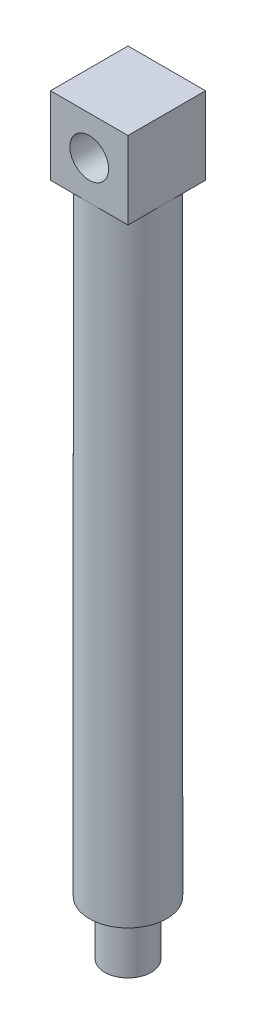
ISO-10303-21;
HEADER;
FILE_DESCRIPTION(('STEP AP214'),'2;1');
FILE_NAME('part.step','',(''),(''),'','','');
FILE_SCHEMA(('AUTOMOTIVE_DESIGN { 1 0 10303 214 1 1 1 1 }'));
ENDSEC;
DATA;
#1=APPLICATION_CONTEXT('core data for automotive mechanical design processes');
#2=APPLICATION_PROTOCOL_DEFINITION('international standard','automotive_design',2000,#1);
#3=PRODUCT_CONTEXT('',#1,'mechanical');
#4=PRODUCT('Part','Part','',(#3));
#5=PRODUCT_RELATED_PRODUCT_CATEGORY('part','',(#4));
#6=PRODUCT_DEFINITION_FORMATION('','',#4);
#7=PRODUCT_DEFINITION_CONTEXT('part definition',#1,'design');
#8=PRODUCT_DEFINITION('design','',#6,#7);
#9=PRODUCT_DEFINITION_SHAPE('','',#8);
#10=(LENGTH_UNIT() NAMED_UNIT(*) SI_UNIT(.MILLI.,.METRE.));
#11=(NAMED_UNIT(*) PLANE_ANGLE_UNIT() SI_UNIT($,.RADIAN.));
#12=(NAMED_UNIT(*) SI_UNIT($,.STERADIAN.) SOLID_ANGLE_UNIT());
#13=UNCERTAINTY_MEASURE_WITH_UNIT(LENGTH_MEASURE(1.E-05),#10,'distance_accuracy_value','');
#14=(GEOMETRIC_REPRESENTATION_CONTEXT(3) GLOBAL_UNCERTAINTY_ASSIGNED_CONTEXT((#13)) GLOBAL_UNIT_ASSIGNED_CONTEXT((#10,
#11,#12)) REPRESENTATION_CONTEXT('',''));
#15=CARTESIAN_POINT('',(0.,0.,0.));
#16=DIRECTION('',(0.,0.,1.));
#17=DIRECTION('',(1.,0.,0.));
#18=AXIS2_PLACEMENT_3D('',#15,#16,#17);
#19=CARTESIAN_POINT('',(0.,0.,10.));
#20=DIRECTION('',(0.,1.,0.));
#21=DIRECTION('',(0.,0.,1.));
#22=AXIS2_PLACEMENT_3D('',#19,#20,#21);
#23=PLANE('',#22);
#24=CARTESIAN_POINT('',(5.,0.,5.));
#25=DIRECTION('',(0.,-1.,0.));
#26=DIRECTION('',(0.,0.,-1.));
#27=AXIS2_PLACEMENT_3D('',#24,#25,#26);
#28=CIRCLE('',#27,5.);
#29=CARTESIAN_POINT('',(5.,0.,0.));
#30=VERTEX_POINT('',#29);
#31=CARTESIAN_POINT('',(10.,0.,5.));
#32=VERTEX_POINT('',#31);
#33=EDGE_CURVE('E117',#30,#32,#28,.T.);
#34=ORIENTED_EDGE('',*,*,#33,.F.);
#35=DIRECTION('',(1.,0.,0.));
#36=VECTOR('',#35,1.);
#37=CARTESIAN_POINT('',(0.,0.,0.));
#38=LINE('',#37,#36);
#39=CARTESIAN_POINT('',(10.,0.,0.));
#40=VERTEX_POINT('',#39);
#41=EDGE_CURVE('E104',#30,#40,#38,.T.);
#42=ORIENTED_EDGE('',*,*,#41,.T.);
#43=DIRECTION('',(0.,0.,-1.));
#44=VECTOR('',#43,1.);
#45=CARTESIAN_POINT('',(10.,0.,10.));
#46=LINE('',#45,#44);
#47=EDGE_CURVE('E118',#32,#40,#46,.T.);
#48=ORIENTED_EDGE('',*,*,#47,.F.);
#49=EDGE_LOOP('',(#34,#42,#48));
#50=FACE_BOUND('',#49,.T.);
#51=ADVANCED_FACE('F39',(#50),#23,.F.);
#52=CARTESIAN_POINT('',(5.,0.,10.));
#53=VERTEX_POINT('',#52);
#54=EDGE_CURVE('E49',#32,#53,#28,.T.);
#55=ORIENTED_EDGE('',*,*,#54,.F.);
#56=CARTESIAN_POINT('',(10.,0.,10.));
#57=VERTEX_POINT('',#56);
#58=EDGE_CURVE('E168',#57,#32,#46,.T.);
#59=ORIENTED_EDGE('',*,*,#58,.F.);
#60=DIRECTION('',(1.,0.,0.));
#61=VECTOR('',#60,1.);
#62=CARTESIAN_POINT('',(0.,0.,10.));
#63=LINE('',#62,#61);
#64=EDGE_CURVE('E152',#53,#57,#63,.T.);
#65=ORIENTED_EDGE('',*,*,#64,.F.);
#66=EDGE_LOOP('',(#55,#59,#65));
#67=FACE_BOUND('',#66,.T.);
#68=ADVANCED_FACE('F187',(#67),#23,.F.);
#69=CARTESIAN_POINT('',(0.,0.,5.));
#70=VERTEX_POINT('',#69);
#71=EDGE_CURVE('E65',#53,#70,#28,.T.);
#72=ORIENTED_EDGE('',*,*,#71,.F.);
#73=CARTESIAN_POINT('',(0.,0.,10.));
#74=VERTEX_POINT('',#73);
#75=EDGE_CURVE('E153',#74,#53,#63,.T.);
#76=ORIENTED_EDGE('',*,*,#75,.F.);
#77=DIRECTION('',(0.,0.,-1.));
#78=VECTOR('',#77,1.);
#79=CARTESIAN_POINT('',(0.,0.,10.));
#80=LINE('',#79,#78);
#81=EDGE_CURVE('E131',#74,#70,#80,.T.);
#82=ORIENTED_EDGE('',*,*,#81,.T.);
#83=EDGE_LOOP('',(#72,#76,#82));
#84=FACE_BOUND('',#83,.T.);
#85=ADVANCED_FACE('F190',(#84),#23,.F.);
#86=CARTESIAN_POINT('',(0.,10.,10.));
#87=DIRECTION('',(0.,1.,0.));
#88=DIRECTION('',(0.,0.,1.));
#89=AXIS2_PLACEMENT_3D('',#86,#87,#88);
#90=PLANE('',#89);
#91=DIRECTION('',(1.,0.,0.));
#92=VECTOR('',#91,1.);
#93=CARTESIAN_POINT('',(0.,10.,0.));
#94=LINE('',#93,#92);
#95=CARTESIAN_POINT('',(0.,10.,0.));
#96=VERTEX_POINT('',#95);
#97=CARTESIAN_POINT('',(10.,10.,0.));
#98=VERTEX_POINT('',#97);
#99=EDGE_CURVE('E139',#96,#98,#94,.T.);
#100=ORIENTED_EDGE('',*,*,#99,.F.);
#101=DIRECTION('',(0.,0.,-1.));
#102=VECTOR('',#101,1.);
#103=CARTESIAN_POINT('',(0.,10.,10.));
#104=LINE('',#103,#102);
#105=CARTESIAN_POINT('',(0.,10.,10.));
#106=VERTEX_POINT('',#105);
#107=EDGE_CURVE('E128',#106,#96,#104,.T.);
#108=ORIENTED_EDGE('',*,*,#107,.F.);
#109=DIRECTION('',(1.,0.,0.));
#110=VECTOR('',#109,1.);
#111=CARTESIAN_POINT('',(0.,10.,10.));
#112=LINE('',#111,#110);
#113=CARTESIAN_POINT('',(10.,10.,10.));
#114=VERTEX_POINT('',#113);
#115=EDGE_CURVE('E144',#106,#114,#112,.T.);
#116=ORIENTED_EDGE('',*,*,#115,.T.);
#117=DIRECTION('',(0.,0.,-1.));
#118=VECTOR('',#117,1.);
#119=CARTESIAN_POINT('',(10.,10.,10.));
#120=LINE('',#119,#118);
#121=EDGE_CURVE('E43',#114,#98,#120,.T.);
#122=ORIENTED_EDGE('',*,*,#121,.T.);
#123=EDGE_LOOP('',(#100,#108,#116,#122));
#124=FACE_BOUND('',#123,.T.);
#125=ADVANCED_FACE('F41',(#124),#90,.T.);
#126=CARTESIAN_POINT('',(0.,0.,10.));
#127=DIRECTION('',(-1.,0.,0.));
#128=DIRECTION('',(0.,0.,1.));
#129=AXIS2_PLACEMENT_3D('',#126,#127,#128);
#130=PLANE('',#129);
#131=DIRECTION('',(0.,1.,0.));
#132=VECTOR('',#131,1.);
#133=CARTESIAN_POINT('',(0.,0.,0.));
#134=LINE('',#133,#132);
#135=CARTESIAN_POINT('',(0.,0.,0.));
#136=VERTEX_POINT('',#135);
#137=EDGE_CURVE('E103',#136,#96,#134,.T.);
#138=ORIENTED_EDGE('',*,*,#137,.F.);
#139=EDGE_CURVE('E98',#70,#136,#80,.T.);
#140=ORIENTED_EDGE('',*,*,#139,.F.);
#141=ORIENTED_EDGE('',*,*,#81,.F.);
#142=DIRECTION('',(0.,1.,0.));
#143=VECTOR('',#142,1.);
#144=CARTESIAN_POINT('',(0.,0.,10.));
#145=LINE('',#144,#143);
#146=EDGE_CURVE('E157',#74,#106,#145,.T.);
#147=ORIENTED_EDGE('',*,*,#146,.T.);
#148=ORIENTED_EDGE('',*,*,#107,.T.);
#149=EDGE_LOOP('',(#138,#140,#141,#147,#148));
#150=FACE_BOUND('',#149,.T.);
#151=ADVANCED_FACE('F181',(#150),#130,.T.);
#152=EDGE_CURVE('E57',#70,#30,#28,.T.);
#153=ORIENTED_EDGE('',*,*,#152,.F.);
#154=ORIENTED_EDGE('',*,*,#139,.T.);
#155=EDGE_CURVE('E95',#136,#30,#38,.T.);
#156=ORIENTED_EDGE('',*,*,#155,.T.);
#157=EDGE_LOOP('',(#153,#154,#156));
#158=FACE_BOUND('',#157,.T.);
#159=ADVANCED_FACE('F97',(#158),#23,.F.);
#160=CARTESIAN_POINT('',(10.,10.,10.));
#161=DIRECTION('',(1.,0.,0.));
#162=DIRECTION('',(0.,1.,0.));
#163=AXIS2_PLACEMENT_3D('',#160,#161,#162);
#164=PLANE('',#163);
#165=DIRECTION('',(0.,-1.,0.));
#166=VECTOR('',#165,1.);
#167=CARTESIAN_POINT('',(10.,10.,0.));
#168=LINE('',#167,#166);
#169=EDGE_CURVE('E112',#98,#40,#168,.T.);
#170=ORIENTED_EDGE('',*,*,#169,.F.);
#171=ORIENTED_EDGE('',*,*,#121,.F.);
#172=DIRECTION('',(0.,-1.,0.));
#173=VECTOR('',#172,1.);
#174=CARTESIAN_POINT('',(10.,10.,10.));
#175=LINE('',#174,#173);
#176=EDGE_CURVE('E148',#114,#57,#175,.T.);
#177=ORIENTED_EDGE('',*,*,#176,.T.);
#178=ORIENTED_EDGE('',*,*,#58,.T.);
#179=ORIENTED_EDGE('',*,*,#47,.T.);
#180=EDGE_LOOP('',(#170,#171,#177,#178,#179));
#181=FACE_BOUND('',#180,.T.);
#182=ADVANCED_FACE('F179',(#181),#164,.T.);
#183=CARTESIAN_POINT('',(0.,0.,10.));
#184=DIRECTION('',(0.,0.,-1.));
#185=DIRECTION('',(-1.,0.,0.));
#186=AXIS2_PLACEMENT_3D('',#183,#184,#185);
#187=PLANE('',#186);
#188=CARTESIAN_POINT('',(5.,5.,10.));
#189=DIRECTION('',(0.,0.,1.));
#190=DIRECTION('',(1.,0.,0.));
#191=AXIS2_PLACEMENT_3D('',#188,#189,#190);
#192=CIRCLE('',#191,2.5);
#193=CARTESIAN_POINT('',(7.5,5.,10.));
#194=VERTEX_POINT('',#193);
#195=EDGE_CURVE('E140',#194,#194,#192,.T.);
#196=ORIENTED_EDGE('',*,*,#195,.F.);
#197=EDGE_LOOP('',(#196));
#198=FACE_BOUND('',#197,.T.);
#199=ORIENTED_EDGE('',*,*,#115,.F.);
#200=ORIENTED_EDGE('',*,*,#146,.F.);
#201=ORIENTED_EDGE('',*,*,#75,.T.);
#202=ORIENTED_EDGE('',*,*,#64,.T.);
#203=ORIENTED_EDGE('',*,*,#176,.F.);
#204=EDGE_LOOP('',(#199,#200,#201,#202,#203));
#205=FACE_BOUND('',#204,.T.);
#206=ADVANCED_FACE('F184',(#198,#205),#187,.F.);
#207=CARTESIAN_POINT('',(0.,0.,0.));
#208=DIRECTION('',(0.,0.,-1.));
#209=DIRECTION('',(-1.,0.,0.));
#210=AXIS2_PLACEMENT_3D('',#207,#208,#209);
#211=PLANE('',#210);
#212=CARTESIAN_POINT('',(5.,5.,0.));
#213=DIRECTION('',(0.,0.,1.));
#214=DIRECTION('',(1.,0.,0.));
#215=AXIS2_PLACEMENT_3D('',#212,#213,#214);
#216=CIRCLE('',#215,2.5);
#217=CARTESIAN_POINT('',(7.5,5.,0.));
#218=VERTEX_POINT('',#217);
#219=EDGE_CURVE('E135',#218,#218,#216,.T.);
#220=ORIENTED_EDGE('',*,*,#219,.T.);
#221=EDGE_LOOP('',(#220));
#222=FACE_BOUND('',#221,.T.);
#223=ORIENTED_EDGE('',*,*,#99,.T.);
#224=ORIENTED_EDGE('',*,*,#169,.T.);
#225=ORIENTED_EDGE('',*,*,#41,.F.);
#226=ORIENTED_EDGE('',*,*,#155,.F.);
#227=ORIENTED_EDGE('',*,*,#137,.T.);
#228=EDGE_LOOP('',(#223,#224,#225,#226,#227));
#229=FACE_BOUND('',#228,.T.);
#230=ADVANCED_FACE('F110',(#222,#229),#211,.T.);
#231=CARTESIAN_POINT('',(5.,5.,0.));
#232=DIRECTION('',(0.,0.,1.));
#233=DIRECTION('',(1.,0.,0.));
#234=AXIS2_PLACEMENT_3D('',#231,#232,#233);
#235=CYLINDRICAL_SURFACE('',#234,2.5);
#236=ORIENTED_EDGE('',*,*,#219,.F.);
#237=EDGE_LOOP('',(#236));
#238=FACE_BOUND('',#237,.T.);
#239=ORIENTED_EDGE('',*,*,#195,.T.);
#240=EDGE_LOOP('',(#239));
#241=FACE_BOUND('',#240,.T.);
#242=ADVANCED_FACE('F208',(#238,#241),#235,.F.);
#243=CARTESIAN_POINT('',(5.,-80.,5.));
#244=DIRECTION('',(0.,1.,0.));
#245=DIRECTION('',(0.,0.,1.));
#246=AXIS2_PLACEMENT_3D('',#243,#244,#245);
#247=CYLINDRICAL_SURFACE('',#246,5.);
#248=CARTESIAN_POINT('',(5.,-80.,5.));
#249=DIRECTION('',(0.,-1.,0.));
#250=DIRECTION('',(0.,0.,-1.));
#251=AXIS2_PLACEMENT_3D('',#248,#249,#250);
#252=CIRCLE('',#251,5.);
#253=CARTESIAN_POINT('',(5.,-80.,0.));
#254=VERTEX_POINT('',#253);
#255=EDGE_CURVE('E123',#254,#254,#252,.T.);
#256=ORIENTED_EDGE('',*,*,#255,.F.);
#257=EDGE_LOOP('',(#256));
#258=FACE_BOUND('',#257,.T.);
#259=ORIENTED_EDGE('',*,*,#33,.T.);
#260=ORIENTED_EDGE('',*,*,#54,.T.);
#261=ORIENTED_EDGE('',*,*,#71,.T.);
#262=ORIENTED_EDGE('',*,*,#152,.T.);
#263=EDGE_LOOP('',(#259,#260,#261,#262));
#264=FACE_BOUND('',#263,.T.);
#265=ADVANCED_FACE('F126',(#258,#264),#247,.T.);
#266=CARTESIAN_POINT('',(5.,-80.,5.));
#267=DIRECTION('',(0.,-1.,0.));
#268=DIRECTION('',(0.,0.,-1.));
#269=AXIS2_PLACEMENT_3D('',#266,#267,#268);
#270=PLANE('',#269);
#271=CARTESIAN_POINT('',(5.,-80.,5.));
#272=DIRECTION('',(0.,-1.,0.));
#273=DIRECTION('',(0.,0.,-1.));
#274=AXIS2_PLACEMENT_3D('',#271,#272,#273);
#275=CIRCLE('',#274,3.);
#276=CARTESIAN_POINT('',(5.,-80.,2.));
#277=VERTEX_POINT('',#276);
#278=EDGE_CURVE('E11',#277,#277,#275,.T.);
#279=ORIENTED_EDGE('',*,*,#278,.F.);
#280=EDGE_LOOP('',(#279));
#281=FACE_BOUND('',#280,.T.);
#282=ORIENTED_EDGE('',*,*,#255,.T.);
#283=EDGE_LOOP('',(#282));
#284=FACE_BOUND('',#283,.T.);
#285=ADVANCED_FACE('F217',(#281,#284),#270,.T.);
#286=CARTESIAN_POINT('',(5.,-87.,5.));
#287=DIRECTION('',(0.,1.,0.));
#288=DIRECTION('',(0.,0.,1.));
#289=AXIS2_PLACEMENT_3D('',#286,#287,#288);
#290=CYLINDRICAL_SURFACE('',#289,3.);
#291=CARTESIAN_POINT('',(5.,-87.,5.));
#292=DIRECTION('',(0.,-1.,0.));
#293=DIRECTION('',(0.,0.,-1.));
#294=AXIS2_PLACEMENT_3D('',#291,#292,#293);
#295=CIRCLE('',#294,3.);
#296=CARTESIAN_POINT('',(5.,-87.,2.));
#297=VERTEX_POINT('',#296);
#298=EDGE_CURVE('E124',#297,#297,#295,.T.);
#299=ORIENTED_EDGE('',*,*,#298,.F.);
#300=EDGE_LOOP('',(#299));
#301=FACE_BOUND('',#300,.T.);
#302=ORIENTED_EDGE('',*,*,#278,.T.);
#303=EDGE_LOOP('',(#302));
#304=FACE_BOUND('',#303,.T.);
#305=ADVANCED_FACE('F221',(#301,#304),#290,.T.);
#306=CARTESIAN_POINT('',(5.,-87.,5.));
#307=DIRECTION('',(0.,-1.,0.));
#308=DIRECTION('',(0.,0.,-1.));
#309=AXIS2_PLACEMENT_3D('',#306,#307,#308);
#310=PLANE('',#309);
#311=ORIENTED_EDGE('',*,*,#298,.T.);
#312=EDGE_LOOP('',(#311));
#313=FACE_BOUND('',#312,.T.);
#314=ADVANCED_FACE('F225',(#313),#310,.T.);
#315=CLOSED_SHELL('',(#51,#68,#85,#125,#151,#159,#182,#206,#230,#242,#265,#285,#305,#314));
#316=MANIFOLD_SOLID_BREP('B2',#315);
#317=ADVANCED_BREP_SHAPE_REPRESENTATION('',(#18,#316),#14);
#318=SHAPE_DEFINITION_REPRESENTATION(#9,#317);
ENDSEC;
END-ISO-10303-21;
